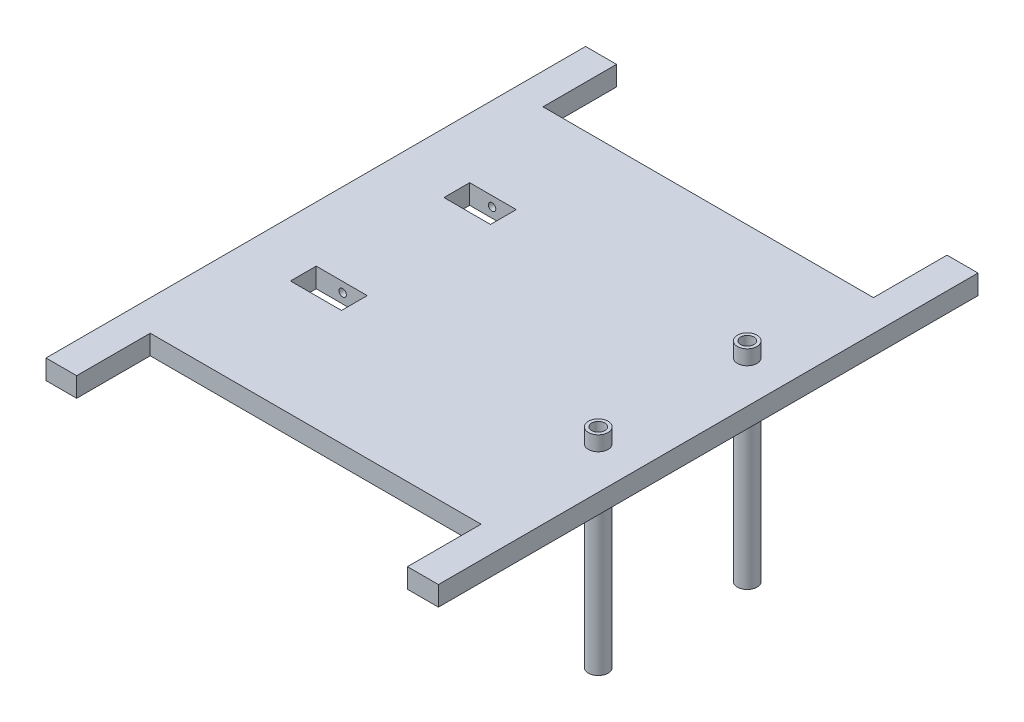
ISO-10303-21;
HEADER;
FILE_DESCRIPTION(('STEP AP214'),'2;1');
FILE_NAME('part.step','',(''),(''),'','','');
FILE_SCHEMA(('AUTOMOTIVE_DESIGN { 1 0 10303 214 1 1 1 1 }'));
ENDSEC;
DATA;
#1=APPLICATION_CONTEXT('core data for automotive mechanical design processes');
#2=APPLICATION_PROTOCOL_DEFINITION('international standard','automotive_design',2000,#1);
#3=PRODUCT_CONTEXT('',#1,'mechanical');
#4=PRODUCT('Part','Part','',(#3));
#5=PRODUCT_RELATED_PRODUCT_CATEGORY('part','',(#4));
#6=PRODUCT_DEFINITION_FORMATION('','',#4);
#7=PRODUCT_DEFINITION_CONTEXT('part definition',#1,'design');
#8=PRODUCT_DEFINITION('design','',#6,#7);
#9=PRODUCT_DEFINITION_SHAPE('','',#8);
#10=(LENGTH_UNIT() NAMED_UNIT(*) SI_UNIT(.MILLI.,.METRE.));
#11=(NAMED_UNIT(*) PLANE_ANGLE_UNIT() SI_UNIT($,.RADIAN.));
#12=(NAMED_UNIT(*) SI_UNIT($,.STERADIAN.) SOLID_ANGLE_UNIT());
#13=UNCERTAINTY_MEASURE_WITH_UNIT(LENGTH_MEASURE(1.E-05),#10,'distance_accuracy_value','');
#14=(GEOMETRIC_REPRESENTATION_CONTEXT(3) GLOBAL_UNCERTAINTY_ASSIGNED_CONTEXT((#13)) GLOBAL_UNIT_ASSIGNED_CONTEXT((#10,
#11,#12)) REPRESENTATION_CONTEXT('',''));
#15=CARTESIAN_POINT('',(0.,0.,0.));
#16=DIRECTION('',(0.,0.,1.));
#17=DIRECTION('',(1.,0.,0.));
#18=AXIS2_PLACEMENT_3D('',#15,#16,#17);
#19=CARTESIAN_POINT('',(160.,-4.,-80.));
#20=DIRECTION('',(0.,0.,1.));
#21=DIRECTION('',(1.,0.,0.));
#22=AXIS2_PLACEMENT_3D('',#19,#20,#21);
#23=PLANE('',#22);
#24=DIRECTION('',(0.,-1.,0.));
#25=VECTOR('',#24,1.);
#26=CARTESIAN_POINT('',(12.63,4.,-80.));
#27=LINE('',#26,#25);
#28=CARTESIAN_POINT('',(12.63,4.,-80.));
#29=VERTEX_POINT('',#28);
#30=CARTESIAN_POINT('',(12.63,-4.,-80.));
#31=VERTEX_POINT('',#30);
#32=EDGE_CURVE('E218',#29,#31,#27,.T.);
#33=ORIENTED_EDGE('',*,*,#32,.F.);
#34=DIRECTION('',(-1.,0.,0.));
#35=VECTOR('',#34,1.);
#36=CARTESIAN_POINT('',(160.,4.,-80.));
#37=LINE('',#36,#35);
#38=CARTESIAN_POINT('',(147.37,4.,-80.));
#39=VERTEX_POINT('',#38);
#40=EDGE_CURVE('E372',#39,#29,#37,.T.);
#41=ORIENTED_EDGE('',*,*,#40,.F.);
#42=DIRECTION('',(0.,1.,0.));
#43=VECTOR('',#42,1.);
#44=CARTESIAN_POINT('',(147.37,4.,-80.));
#45=LINE('',#44,#43);
#46=CARTESIAN_POINT('',(147.37,-4.,-80.));
#47=VERTEX_POINT('',#46);
#48=EDGE_CURVE('E275',#47,#39,#45,.T.);
#49=ORIENTED_EDGE('',*,*,#48,.F.);
#50=DIRECTION('',(-1.,0.,0.));
#51=VECTOR('',#50,1.);
#52=CARTESIAN_POINT('',(160.,-4.,-80.));
#53=LINE('',#52,#51);
#54=EDGE_CURVE('E359',#47,#31,#53,.T.);
#55=ORIENTED_EDGE('',*,*,#54,.T.);
#56=EDGE_LOOP('',(#33,#41,#49,#55));
#57=FACE_BOUND('',#56,.T.);
#58=ADVANCED_FACE('F43',(#57),#23,.F.);
#59=CARTESIAN_POINT('',(160.,-4.,80.));
#60=DIRECTION('',(0.,0.,-1.));
#61=DIRECTION('',(-1.,0.,0.));
#62=AXIS2_PLACEMENT_3D('',#59,#60,#61);
#63=PLANE('',#62);
#64=DIRECTION('',(0.,-1.,0.));
#65=VECTOR('',#64,1.);
#66=CARTESIAN_POINT('',(147.37,-4.,80.));
#67=LINE('',#66,#65);
#68=CARTESIAN_POINT('',(147.37,4.,80.));
#69=VERTEX_POINT('',#68);
#70=CARTESIAN_POINT('',(147.37,-4.,80.));
#71=VERTEX_POINT('',#70);
#72=EDGE_CURVE('E301',#69,#71,#67,.T.);
#73=ORIENTED_EDGE('',*,*,#72,.F.);
#74=DIRECTION('',(-1.,0.,0.));
#75=VECTOR('',#74,1.);
#76=CARTESIAN_POINT('',(160.,4.,80.));
#77=LINE('',#76,#75);
#78=CARTESIAN_POINT('',(12.5,4.,80.));
#79=VERTEX_POINT('',#78);
#80=EDGE_CURVE('E369',#69,#79,#77,.T.);
#81=ORIENTED_EDGE('',*,*,#80,.T.);
#82=DIRECTION('',(0.,1.,0.));
#83=VECTOR('',#82,1.);
#84=CARTESIAN_POINT('',(12.5,4.,80.));
#85=LINE('',#84,#83);
#86=CARTESIAN_POINT('',(12.5,-4.,80.));
#87=VERTEX_POINT('',#86);
#88=EDGE_CURVE('E325',#87,#79,#85,.T.);
#89=ORIENTED_EDGE('',*,*,#88,.F.);
#90=DIRECTION('',(-1.,0.,0.));
#91=VECTOR('',#90,1.);
#92=CARTESIAN_POINT('',(160.,-4.,80.));
#93=LINE('',#92,#91);
#94=EDGE_CURVE('E366',#71,#87,#93,.T.);
#95=ORIENTED_EDGE('',*,*,#94,.F.);
#96=EDGE_LOOP('',(#73,#81,#89,#95));
#97=FACE_BOUND('',#96,.T.);
#98=ADVANCED_FACE('F475',(#97),#63,.F.);
#99=CARTESIAN_POINT('',(160.,4.,80.));
#100=DIRECTION('',(0.,-1.,0.));
#101=DIRECTION('',(0.,0.,-1.));
#102=AXIS2_PLACEMENT_3D('',#99,#100,#101);
#103=PLANE('',#102);
#104=CARTESIAN_POINT('',(142.895014092763,4.,-33.0158476848538));
#105=DIRECTION('',(0.,-1.,0.));
#106=DIRECTION('',(0.,0.,-1.));
#107=AXIS2_PLACEMENT_3D('',#104,#105,#106);
#108=CIRCLE('',#107,3.99999999999999);
#109=CARTESIAN_POINT('',(142.895014092763,4.,-37.0158476848538));
#110=VERTEX_POINT('',#109);
#111=EDGE_CURVE('E429',#110,#110,#108,.T.);
#112=ORIENTED_EDGE('',*,*,#111,.T.);
#113=EDGE_LOOP('',(#112));
#114=FACE_BOUND('',#113,.T.);
#115=CARTESIAN_POINT('',(142.895014092763,4.,27.7315317803512));
#116=DIRECTION('',(0.,-1.,0.));
#117=DIRECTION('',(0.,0.,-1.));
#118=AXIS2_PLACEMENT_3D('',#115,#116,#117);
#119=CIRCLE('',#118,3.99999999999999);
#120=CARTESIAN_POINT('',(142.895014092763,4.,23.7315317803512));
#121=VERTEX_POINT('',#120);
#122=EDGE_CURVE('E413',#121,#121,#119,.T.);
#123=ORIENTED_EDGE('',*,*,#122,.T.);
#124=EDGE_LOOP('',(#123));
#125=FACE_BOUND('',#124,.T.);
#126=DIRECTION('',(-1.,0.,0.));
#127=VECTOR('',#126,1.);
#128=CARTESIAN_POINT('',(24.4683046302924,4.,-38.2658476848538));
#129=LINE('',#128,#127);
#130=CARTESIAN_POINT('',(43.4683046302924,4.,-38.2658476848538));
#131=VERTEX_POINT('',#130);
#132=CARTESIAN_POINT('',(24.4683046302924,4.,-38.2658476848538));
#133=VERTEX_POINT('',#132);
#134=EDGE_CURVE('E200',#131,#133,#129,.T.);
#135=ORIENTED_EDGE('',*,*,#134,.F.);
#136=DIRECTION('',(0.,0.,-1.));
#137=VECTOR('',#136,1.);
#138=CARTESIAN_POINT('',(43.4683046302924,4.,-38.2658476848538));
#139=LINE('',#138,#137);
#140=CARTESIAN_POINT('',(43.4683046302924,4.,-27.7658476848538));
#141=VERTEX_POINT('',#140);
#142=EDGE_CURVE('E60',#141,#131,#139,.T.);
#143=ORIENTED_EDGE('',*,*,#142,.F.);
#144=DIRECTION('',(1.,0.,0.));
#145=VECTOR('',#144,1.);
#146=CARTESIAN_POINT('',(24.4683046302924,4.,-27.7658476848538));
#147=LINE('',#146,#145);
#148=CARTESIAN_POINT('',(24.4683046302924,4.,-27.7658476848538));
#149=VERTEX_POINT('',#148);
#150=EDGE_CURVE('E208',#149,#141,#147,.T.);
#151=ORIENTED_EDGE('',*,*,#150,.F.);
#152=DIRECTION('',(0.,0.,1.));
#153=VECTOR('',#152,1.);
#154=CARTESIAN_POINT('',(24.4683046302924,4.,-38.2658476848538));
#155=LINE('',#154,#153);
#156=EDGE_CURVE('E189',#133,#149,#155,.T.);
#157=ORIENTED_EDGE('',*,*,#156,.F.);
#158=EDGE_LOOP('',(#135,#143,#151,#157));
#159=FACE_BOUND('',#158,.T.);
#160=DIRECTION('',(-1.,0.,0.));
#161=VECTOR('',#160,1.);
#162=CARTESIAN_POINT('',(22.6493816507544,4.,22.4815317803512));
#163=LINE('',#162,#161);
#164=CARTESIAN_POINT('',(43.4683046302924,4.,22.4815317803512));
#165=VERTEX_POINT('',#164);
#166=CARTESIAN_POINT('',(22.6493816507544,4.,22.4815317803512));
#167=VERTEX_POINT('',#166);
#168=EDGE_CURVE('E244',#165,#167,#163,.T.);
#169=ORIENTED_EDGE('',*,*,#168,.F.);
#170=DIRECTION('',(0.,0.,-1.));
#171=VECTOR('',#170,1.);
#172=CARTESIAN_POINT('',(43.4683046302924,4.,32.9815317803512));
#173=LINE('',#172,#171);
#174=CARTESIAN_POINT('',(43.4683046302924,4.,32.9815317803512));
#175=VERTEX_POINT('',#174);
#176=EDGE_CURVE('E68',#175,#165,#173,.T.);
#177=ORIENTED_EDGE('',*,*,#176,.F.);
#178=DIRECTION('',(1.,0.,0.));
#179=VECTOR('',#178,1.);
#180=CARTESIAN_POINT('',(22.6493816507544,4.,32.9815317803512));
#181=LINE('',#180,#179);
#182=CARTESIAN_POINT('',(22.6493816507544,4.,32.9815317803512));
#183=VERTEX_POINT('',#182);
#184=EDGE_CURVE('E226',#183,#175,#181,.T.);
#185=ORIENTED_EDGE('',*,*,#184,.F.);
#186=DIRECTION('',(0.,0.,1.));
#187=VECTOR('',#186,1.);
#188=CARTESIAN_POINT('',(22.6493816507544,4.,32.9815317803512));
#189=LINE('',#188,#187);
#190=EDGE_CURVE('E240',#167,#183,#189,.T.);
#191=ORIENTED_EDGE('',*,*,#190,.F.);
#192=EDGE_LOOP('',(#169,#177,#185,#191));
#193=FACE_BOUND('',#192,.T.);
#194=DIRECTION('',(0.,0.,1.));
#195=VECTOR('',#194,1.);
#196=CARTESIAN_POINT('',(0.,4.,80.));
#197=LINE('',#196,#195);
#198=CARTESIAN_POINT('',(0.,4.,-110.));
#199=VERTEX_POINT('',#198);
#200=CARTESIAN_POINT('',(0.,4.,110.));
#201=VERTEX_POINT('',#200);
#202=EDGE_CURVE('E351',#199,#201,#197,.T.);
#203=ORIENTED_EDGE('',*,*,#202,.T.);
#204=DIRECTION('',(-1.,0.,0.));
#205=VECTOR('',#204,1.);
#206=CARTESIAN_POINT('',(0.,4.,110.));
#207=LINE('',#206,#205);
#208=CARTESIAN_POINT('',(12.5,4.,110.));
#209=VERTEX_POINT('',#208);
#210=EDGE_CURVE('E336',#209,#201,#207,.T.);
#211=ORIENTED_EDGE('',*,*,#210,.F.);
#212=DIRECTION('',(0.,0.,-1.));
#213=VECTOR('',#212,1.);
#214=CARTESIAN_POINT('',(12.5,4.,110.));
#215=LINE('',#214,#213);
#216=EDGE_CURVE('E340',#209,#79,#215,.T.);
#217=ORIENTED_EDGE('',*,*,#216,.T.);
#218=ORIENTED_EDGE('',*,*,#80,.F.);
#219=DIRECTION('',(0.,0.,-1.));
#220=VECTOR('',#219,1.);
#221=CARTESIAN_POINT('',(147.37,4.,110.));
#222=LINE('',#221,#220);
#223=CARTESIAN_POINT('',(147.37,4.,110.));
#224=VERTEX_POINT('',#223);
#225=EDGE_CURVE('E322',#224,#69,#222,.T.);
#226=ORIENTED_EDGE('',*,*,#225,.F.);
#227=DIRECTION('',(-1.,0.,0.));
#228=VECTOR('',#227,1.);
#229=CARTESIAN_POINT('',(160.,4.,110.));
#230=LINE('',#229,#228);
#231=CARTESIAN_POINT('',(160.,4.,110.));
#232=VERTEX_POINT('',#231);
#233=EDGE_CURVE('E306',#232,#224,#230,.T.);
#234=ORIENTED_EDGE('',*,*,#233,.F.);
#235=DIRECTION('',(0.,0.,1.));
#236=VECTOR('',#235,1.);
#237=CARTESIAN_POINT('',(160.,4.,80.));
#238=LINE('',#237,#236);
#239=CARTESIAN_POINT('',(160.,4.,-110.));
#240=VERTEX_POINT('',#239);
#241=EDGE_CURVE('E352',#240,#232,#238,.T.);
#242=ORIENTED_EDGE('',*,*,#241,.F.);
#243=DIRECTION('',(1.,0.,0.));
#244=VECTOR('',#243,1.);
#245=CARTESIAN_POINT('',(160.,4.,-110.));
#246=LINE('',#245,#244);
#247=CARTESIAN_POINT('',(147.37,4.,-110.));
#248=VERTEX_POINT('',#247);
#249=EDGE_CURVE('E286',#248,#240,#246,.T.);
#250=ORIENTED_EDGE('',*,*,#249,.F.);
#251=DIRECTION('',(0.,0.,1.));
#252=VECTOR('',#251,1.);
#253=CARTESIAN_POINT('',(147.37,4.,-110.));
#254=LINE('',#253,#252);
#255=EDGE_CURVE('E290',#248,#39,#254,.T.);
#256=ORIENTED_EDGE('',*,*,#255,.T.);
#257=ORIENTED_EDGE('',*,*,#40,.T.);
#258=DIRECTION('',(0.,0.,1.));
#259=VECTOR('',#258,1.);
#260=CARTESIAN_POINT('',(12.63,4.,-110.));
#261=LINE('',#260,#259);
#262=CARTESIAN_POINT('',(12.63,4.,-110.));
#263=VERTEX_POINT('',#262);
#264=EDGE_CURVE('E271',#263,#29,#261,.T.);
#265=ORIENTED_EDGE('',*,*,#264,.F.);
#266=DIRECTION('',(1.,0.,0.));
#267=VECTOR('',#266,1.);
#268=CARTESIAN_POINT('',(0.,4.,-110.));
#269=LINE('',#268,#267);
#270=EDGE_CURVE('E254',#199,#263,#269,.T.);
#271=ORIENTED_EDGE('',*,*,#270,.F.);
#272=EDGE_LOOP('',(#203,#211,#217,#218,#226,#234,#242,#250,#256,#257,#265,#271));
#273=FACE_BOUND('',#272,.T.);
#274=ADVANCED_FACE('F205',(#114,#125,#159,#193,#273),#103,.F.);
#275=CARTESIAN_POINT('',(160.,-4.,80.));
#276=DIRECTION('',(0.,1.,0.));
#277=DIRECTION('',(0.,0.,1.));
#278=AXIS2_PLACEMENT_3D('',#275,#276,#277);
#279=PLANE('',#278);
#280=CARTESIAN_POINT('',(142.895014092763,-4.,-33.0158476848538));
#281=DIRECTION('',(0.,1.,0.));
#282=DIRECTION('',(0.,0.,1.));
#283=AXIS2_PLACEMENT_3D('',#280,#281,#282);
#284=CIRCLE('',#283,3.99999999999999);
#285=CARTESIAN_POINT('',(142.895014092763,-4.,-29.0158476848538));
#286=VERTEX_POINT('',#285);
#287=EDGE_CURVE('E46',#286,#286,#284,.T.);
#288=ORIENTED_EDGE('',*,*,#287,.T.);
#289=EDGE_LOOP('',(#288));
#290=FACE_BOUND('',#289,.T.);
#291=CARTESIAN_POINT('',(142.895014092763,-4.,27.7315317803512));
#292=DIRECTION('',(0.,1.,0.));
#293=DIRECTION('',(0.,0.,1.));
#294=AXIS2_PLACEMENT_3D('',#291,#292,#293);
#295=CIRCLE('',#294,3.99999999999999);
#296=CARTESIAN_POINT('',(142.895014092763,-4.,31.7315317803512));
#297=VERTEX_POINT('',#296);
#298=EDGE_CURVE('E410',#297,#297,#295,.T.);
#299=ORIENTED_EDGE('',*,*,#298,.T.);
#300=EDGE_LOOP('',(#299));
#301=FACE_BOUND('',#300,.T.);
#302=DIRECTION('',(1.,0.,0.));
#303=VECTOR('',#302,1.);
#304=CARTESIAN_POINT('',(160.,-4.,-27.7658476848538));
#305=LINE('',#304,#303);
#306=CARTESIAN_POINT('',(24.4683046302924,-4.,-27.7658476848538));
#307=VERTEX_POINT('',#306);
#308=CARTESIAN_POINT('',(43.4683046302924,-4.,-27.7658476848538));
#309=VERTEX_POINT('',#308);
#310=EDGE_CURVE('E52',#307,#309,#305,.T.);
#311=ORIENTED_EDGE('',*,*,#310,.T.);
#312=DIRECTION('',(0.,0.,-1.));
#313=VECTOR('',#312,1.);
#314=CARTESIAN_POINT('',(43.4683046302924,-4.,80.));
#315=LINE('',#314,#313);
#316=CARTESIAN_POINT('',(43.4683046302924,-4.,-38.2658476848538));
#317=VERTEX_POINT('',#316);
#318=EDGE_CURVE('E11',#309,#317,#315,.T.);
#319=ORIENTED_EDGE('',*,*,#318,.T.);
#320=DIRECTION('',(-1.,0.,0.));
#321=VECTOR('',#320,1.);
#322=CARTESIAN_POINT('',(160.,-4.,-38.2658476848538));
#323=LINE('',#322,#321);
#324=CARTESIAN_POINT('',(24.4683046302924,-4.,-38.2658476848538));
#325=VERTEX_POINT('',#324);
#326=EDGE_CURVE('E392',#317,#325,#323,.T.);
#327=ORIENTED_EDGE('',*,*,#326,.T.);
#328=DIRECTION('',(0.,0.,1.));
#329=VECTOR('',#328,1.);
#330=CARTESIAN_POINT('',(24.4683046302924,-4.,80.));
#331=LINE('',#330,#329);
#332=EDGE_CURVE('E192',#325,#307,#331,.T.);
#333=ORIENTED_EDGE('',*,*,#332,.T.);
#334=EDGE_LOOP('',(#311,#319,#327,#333));
#335=FACE_BOUND('',#334,.T.);
#336=DIRECTION('',(1.,0.,0.));
#337=VECTOR('',#336,1.);
#338=CARTESIAN_POINT('',(160.,-4.,32.9815317803512));
#339=LINE('',#338,#337);
#340=CARTESIAN_POINT('',(22.6493816507544,-4.,32.9815317803512));
#341=VERTEX_POINT('',#340);
#342=CARTESIAN_POINT('',(43.4683046302924,-4.,32.9815317803512));
#343=VERTEX_POINT('',#342);
#344=EDGE_CURVE('E384',#341,#343,#339,.T.);
#345=ORIENTED_EDGE('',*,*,#344,.T.);
#346=DIRECTION('',(0.,0.,-1.));
#347=VECTOR('',#346,1.);
#348=CARTESIAN_POINT('',(43.4683046302924,-4.,80.));
#349=LINE('',#348,#347);
#350=CARTESIAN_POINT('',(43.4683046302924,-4.,22.4815317803512));
#351=VERTEX_POINT('',#350);
#352=EDGE_CURVE('E388',#343,#351,#349,.T.);
#353=ORIENTED_EDGE('',*,*,#352,.T.);
#354=DIRECTION('',(-1.,0.,0.));
#355=VECTOR('',#354,1.);
#356=CARTESIAN_POINT('',(160.,-4.,22.4815317803512));
#357=LINE('',#356,#355);
#358=CARTESIAN_POINT('',(22.6493816507544,-4.,22.4815317803512));
#359=VERTEX_POINT('',#358);
#360=EDGE_CURVE('E376',#351,#359,#357,.T.);
#361=ORIENTED_EDGE('',*,*,#360,.T.);
#362=DIRECTION('',(0.,0.,1.));
#363=VECTOR('',#362,1.);
#364=CARTESIAN_POINT('',(22.6493816507544,-4.,80.));
#365=LINE('',#364,#363);
#366=EDGE_CURVE('E380',#359,#341,#365,.T.);
#367=ORIENTED_EDGE('',*,*,#366,.T.);
#368=EDGE_LOOP('',(#345,#353,#361,#367));
#369=FACE_BOUND('',#368,.T.);
#370=DIRECTION('',(0.,0.,-1.));
#371=VECTOR('',#370,1.);
#372=CARTESIAN_POINT('',(0.,-4.,80.));
#373=LINE('',#372,#371);
#374=CARTESIAN_POINT('',(0.,-4.,110.));
#375=VERTEX_POINT('',#374);
#376=CARTESIAN_POINT('',(0.,-4.,-110.));
#377=VERTEX_POINT('',#376);
#378=EDGE_CURVE('E356',#375,#377,#373,.T.);
#379=ORIENTED_EDGE('',*,*,#378,.T.);
#380=DIRECTION('',(-1.,0.,0.));
#381=VECTOR('',#380,1.);
#382=CARTESIAN_POINT('',(0.,-4.,-110.));
#383=LINE('',#382,#381);
#384=CARTESIAN_POINT('',(12.63,-4.,-110.));
#385=VERTEX_POINT('',#384);
#386=EDGE_CURVE('E260',#385,#377,#383,.T.);
#387=ORIENTED_EDGE('',*,*,#386,.F.);
#388=DIRECTION('',(0.,0.,1.));
#389=VECTOR('',#388,1.);
#390=CARTESIAN_POINT('',(12.63,-4.,-110.));
#391=LINE('',#390,#389);
#392=EDGE_CURVE('E264',#385,#31,#391,.T.);
#393=ORIENTED_EDGE('',*,*,#392,.T.);
#394=ORIENTED_EDGE('',*,*,#54,.F.);
#395=DIRECTION('',(0.,0.,1.));
#396=VECTOR('',#395,1.);
#397=CARTESIAN_POINT('',(147.37,-4.,-110.));
#398=LINE('',#397,#396);
#399=CARTESIAN_POINT('',(147.37,-4.,-110.));
#400=VERTEX_POINT('',#399);
#401=EDGE_CURVE('E297',#400,#47,#398,.T.);
#402=ORIENTED_EDGE('',*,*,#401,.F.);
#403=DIRECTION('',(-1.,0.,0.));
#404=VECTOR('',#403,1.);
#405=CARTESIAN_POINT('',(160.,-4.,-110.));
#406=LINE('',#405,#404);
#407=CARTESIAN_POINT('',(160.,-4.,-110.));
#408=VERTEX_POINT('',#407);
#409=EDGE_CURVE('E280',#408,#400,#406,.T.);
#410=ORIENTED_EDGE('',*,*,#409,.F.);
#411=DIRECTION('',(0.,0.,-1.));
#412=VECTOR('',#411,1.);
#413=CARTESIAN_POINT('',(160.,-4.,80.));
#414=LINE('',#413,#412);
#415=CARTESIAN_POINT('',(160.,-4.,110.));
#416=VERTEX_POINT('',#415);
#417=EDGE_CURVE('E355',#416,#408,#414,.T.);
#418=ORIENTED_EDGE('',*,*,#417,.F.);
#419=DIRECTION('',(1.,0.,0.));
#420=VECTOR('',#419,1.);
#421=CARTESIAN_POINT('',(160.,-4.,110.));
#422=LINE('',#421,#420);
#423=CARTESIAN_POINT('',(147.37,-4.,110.));
#424=VERTEX_POINT('',#423);
#425=EDGE_CURVE('E312',#424,#416,#422,.T.);
#426=ORIENTED_EDGE('',*,*,#425,.F.);
#427=DIRECTION('',(0.,0.,-1.));
#428=VECTOR('',#427,1.);
#429=CARTESIAN_POINT('',(147.37,-4.,110.));
#430=LINE('',#429,#428);
#431=EDGE_CURVE('E316',#424,#71,#430,.T.);
#432=ORIENTED_EDGE('',*,*,#431,.T.);
#433=ORIENTED_EDGE('',*,*,#94,.T.);
#434=DIRECTION('',(0.,0.,-1.));
#435=VECTOR('',#434,1.);
#436=CARTESIAN_POINT('',(12.5,-4.,110.));
#437=LINE('',#436,#435);
#438=CARTESIAN_POINT('',(12.5,-4.,110.));
#439=VERTEX_POINT('',#438);
#440=EDGE_CURVE('E347',#439,#87,#437,.T.);
#441=ORIENTED_EDGE('',*,*,#440,.F.);
#442=DIRECTION('',(1.,0.,0.));
#443=VECTOR('',#442,1.);
#444=CARTESIAN_POINT('',(0.,-4.,110.));
#445=LINE('',#444,#443);
#446=EDGE_CURVE('E330',#375,#439,#445,.T.);
#447=ORIENTED_EDGE('',*,*,#446,.F.);
#448=EDGE_LOOP('',(#379,#387,#393,#394,#402,#410,#418,#426,#432,#433,#441,#447));
#449=FACE_BOUND('',#448,.T.);
#450=ADVANCED_FACE('F509',(#290,#301,#335,#369,#449),#279,.F.);
#451=CARTESIAN_POINT('',(160.,0.,0.));
#452=DIRECTION('',(-1.,0.,0.));
#453=DIRECTION('',(0.,0.,1.));
#454=AXIS2_PLACEMENT_3D('',#451,#452,#453);
#455=PLANE('',#454);
#456=ORIENTED_EDGE('',*,*,#417,.T.);
#457=DIRECTION('',(0.,-1.,0.));
#458=VECTOR('',#457,1.);
#459=CARTESIAN_POINT('',(160.,4.,-110.));
#460=LINE('',#459,#458);
#461=EDGE_CURVE('E276',#240,#408,#460,.T.);
#462=ORIENTED_EDGE('',*,*,#461,.F.);
#463=ORIENTED_EDGE('',*,*,#241,.T.);
#464=DIRECTION('',(0.,1.,0.));
#465=VECTOR('',#464,1.);
#466=CARTESIAN_POINT('',(160.,-4.,110.));
#467=LINE('',#466,#465);
#468=EDGE_CURVE('E302',#416,#232,#467,.T.);
#469=ORIENTED_EDGE('',*,*,#468,.F.);
#470=EDGE_LOOP('',(#456,#462,#463,#469));
#471=FACE_BOUND('',#470,.T.);
#472=ADVANCED_FACE('F528',(#471),#455,.F.);
#473=CARTESIAN_POINT('',(0.,0.,0.));
#474=DIRECTION('',(-1.,0.,0.));
#475=DIRECTION('',(0.,0.,1.));
#476=AXIS2_PLACEMENT_3D('',#473,#474,#475);
#477=PLANE('',#476);
#478=ORIENTED_EDGE('',*,*,#202,.F.);
#479=DIRECTION('',(0.,1.,0.));
#480=VECTOR('',#479,1.);
#481=CARTESIAN_POINT('',(0.,4.,-110.));
#482=LINE('',#481,#480);
#483=EDGE_CURVE('E250',#377,#199,#482,.T.);
#484=ORIENTED_EDGE('',*,*,#483,.F.);
#485=ORIENTED_EDGE('',*,*,#378,.F.);
#486=DIRECTION('',(0.,-1.,0.));
#487=VECTOR('',#486,1.);
#488=CARTESIAN_POINT('',(0.,4.,110.));
#489=LINE('',#488,#487);
#490=EDGE_CURVE('E326',#201,#375,#489,.T.);
#491=ORIENTED_EDGE('',*,*,#490,.F.);
#492=EDGE_LOOP('',(#478,#484,#485,#491));
#493=FACE_BOUND('',#492,.T.);
#494=ADVANCED_FACE('F505',(#493),#477,.T.);
#495=CARTESIAN_POINT('',(12.5,4.,110.));
#496=DIRECTION('',(-1.,0.,0.));
#497=DIRECTION('',(0.,-1.,0.));
#498=AXIS2_PLACEMENT_3D('',#495,#496,#497);
#499=PLANE('',#498);
#500=ORIENTED_EDGE('',*,*,#88,.T.);
#501=ORIENTED_EDGE('',*,*,#216,.F.);
#502=DIRECTION('',(0.,1.,0.));
#503=VECTOR('',#502,1.);
#504=CARTESIAN_POINT('',(12.5,4.,110.));
#505=LINE('',#504,#503);
#506=EDGE_CURVE('E333',#439,#209,#505,.T.);
#507=ORIENTED_EDGE('',*,*,#506,.F.);
#508=ORIENTED_EDGE('',*,*,#440,.T.);
#509=EDGE_LOOP('',(#500,#501,#507,#508));
#510=FACE_BOUND('',#509,.T.);
#511=ADVANCED_FACE('F513',(#510),#499,.F.);
#512=CARTESIAN_POINT('',(0.,0.,110.));
#513=DIRECTION('',(0.,0.,1.));
#514=DIRECTION('',(1.,0.,0.));
#515=AXIS2_PLACEMENT_3D('',#512,#513,#514);
#516=PLANE('',#515);
#517=ORIENTED_EDGE('',*,*,#490,.T.);
#518=ORIENTED_EDGE('',*,*,#446,.T.);
#519=ORIENTED_EDGE('',*,*,#506,.T.);
#520=ORIENTED_EDGE('',*,*,#210,.T.);
#521=EDGE_LOOP('',(#517,#518,#519,#520));
#522=FACE_BOUND('',#521,.T.);
#523=ADVANCED_FACE('F502',(#522),#516,.T.);
#524=CARTESIAN_POINT('',(147.37,-4.,110.));
#525=DIRECTION('',(1.,0.,0.));
#526=DIRECTION('',(0.,0.,-1.));
#527=AXIS2_PLACEMENT_3D('',#524,#525,#526);
#528=PLANE('',#527);
#529=ORIENTED_EDGE('',*,*,#72,.T.);
#530=ORIENTED_EDGE('',*,*,#431,.F.);
#531=DIRECTION('',(0.,-1.,0.));
#532=VECTOR('',#531,1.);
#533=CARTESIAN_POINT('',(147.37,-4.,110.));
#534=LINE('',#533,#532);
#535=EDGE_CURVE('E309',#224,#424,#534,.T.);
#536=ORIENTED_EDGE('',*,*,#535,.F.);
#537=ORIENTED_EDGE('',*,*,#225,.T.);
#538=EDGE_LOOP('',(#529,#530,#536,#537));
#539=FACE_BOUND('',#538,.T.);
#540=ADVANCED_FACE('F521',(#539),#528,.F.);
#541=CARTESIAN_POINT('',(0.,0.,110.));
#542=DIRECTION('',(0.,0.,1.));
#543=DIRECTION('',(1.,0.,0.));
#544=AXIS2_PLACEMENT_3D('',#541,#542,#543);
#545=PLANE('',#544);
#546=ORIENTED_EDGE('',*,*,#468,.T.);
#547=ORIENTED_EDGE('',*,*,#233,.T.);
#548=ORIENTED_EDGE('',*,*,#535,.T.);
#549=ORIENTED_EDGE('',*,*,#425,.T.);
#550=EDGE_LOOP('',(#546,#547,#548,#549));
#551=FACE_BOUND('',#550,.T.);
#552=ADVANCED_FACE('F526',(#551),#545,.T.);
#553=CARTESIAN_POINT('',(147.37,4.,-110.));
#554=DIRECTION('',(1.,0.,0.));
#555=DIRECTION('',(0.,0.,-1.));
#556=AXIS2_PLACEMENT_3D('',#553,#554,#555);
#557=PLANE('',#556);
#558=ORIENTED_EDGE('',*,*,#48,.T.);
#559=ORIENTED_EDGE('',*,*,#255,.F.);
#560=DIRECTION('',(0.,1.,0.));
#561=VECTOR('',#560,1.);
#562=CARTESIAN_POINT('',(147.37,4.,-110.));
#563=LINE('',#562,#561);
#564=EDGE_CURVE('E283',#400,#248,#563,.T.);
#565=ORIENTED_EDGE('',*,*,#564,.F.);
#566=ORIENTED_EDGE('',*,*,#401,.T.);
#567=EDGE_LOOP('',(#558,#559,#565,#566));
#568=FACE_BOUND('',#567,.T.);
#569=ADVANCED_FACE('F535',(#568),#557,.F.);
#570=CARTESIAN_POINT('',(0.,0.,-110.));
#571=DIRECTION('',(0.,0.,-1.));
#572=DIRECTION('',(-1.,0.,0.));
#573=AXIS2_PLACEMENT_3D('',#570,#571,#572);
#574=PLANE('',#573);
#575=ORIENTED_EDGE('',*,*,#461,.T.);
#576=ORIENTED_EDGE('',*,*,#409,.T.);
#577=ORIENTED_EDGE('',*,*,#564,.T.);
#578=ORIENTED_EDGE('',*,*,#249,.T.);
#579=EDGE_LOOP('',(#575,#576,#577,#578));
#580=FACE_BOUND('',#579,.T.);
#581=ADVANCED_FACE('F531',(#580),#574,.T.);
#582=CARTESIAN_POINT('',(12.63,4.,-110.));
#583=DIRECTION('',(-1.,0.,0.));
#584=DIRECTION('',(0.,-1.,0.));
#585=AXIS2_PLACEMENT_3D('',#582,#583,#584);
#586=PLANE('',#585);
#587=ORIENTED_EDGE('',*,*,#32,.T.);
#588=ORIENTED_EDGE('',*,*,#392,.F.);
#589=DIRECTION('',(0.,-1.,0.));
#590=VECTOR('',#589,1.);
#591=CARTESIAN_POINT('',(12.63,4.,-110.));
#592=LINE('',#591,#590);
#593=EDGE_CURVE('E257',#263,#385,#592,.T.);
#594=ORIENTED_EDGE('',*,*,#593,.F.);
#595=ORIENTED_EDGE('',*,*,#264,.T.);
#596=EDGE_LOOP('',(#587,#588,#594,#595));
#597=FACE_BOUND('',#596,.T.);
#598=ADVANCED_FACE('F493',(#597),#586,.F.);
#599=CARTESIAN_POINT('',(0.,0.,-110.));
#600=DIRECTION('',(0.,0.,1.));
#601=DIRECTION('',(1.,0.,0.));
#602=AXIS2_PLACEMENT_3D('',#599,#600,#601);
#603=PLANE('',#602);
#604=ORIENTED_EDGE('',*,*,#483,.T.);
#605=ORIENTED_EDGE('',*,*,#270,.T.);
#606=ORIENTED_EDGE('',*,*,#593,.T.);
#607=ORIENTED_EDGE('',*,*,#386,.T.);
#608=EDGE_LOOP('',(#604,#605,#606,#607));
#609=FACE_BOUND('',#608,.T.);
#610=ADVANCED_FACE('F496',(#609),#603,.F.);
#611=CARTESIAN_POINT('',(43.4683046302924,-6.,32.9815317803512));
#612=DIRECTION('',(1.,0.,0.));
#613=DIRECTION('',(0.,0.,-1.));
#614=AXIS2_PLACEMENT_3D('',#611,#612,#613);
#615=PLANE('',#614);
#616=DIRECTION('',(0.,1.,0.));
#617=VECTOR('',#616,1.);
#618=CARTESIAN_POINT('',(43.4683046302924,-6.,32.9815317803512));
#619=LINE('',#618,#617);
#620=EDGE_CURVE('E233',#343,#175,#619,.T.);
#621=ORIENTED_EDGE('',*,*,#620,.T.);
#622=ORIENTED_EDGE('',*,*,#176,.T.);
#623=DIRECTION('',(0.,1.,0.));
#624=VECTOR('',#623,1.);
#625=CARTESIAN_POINT('',(43.4683046302924,-6.,22.4815317803512));
#626=LINE('',#625,#624);
#627=EDGE_CURVE('E223',#351,#165,#626,.T.);
#628=ORIENTED_EDGE('',*,*,#627,.F.);
#629=ORIENTED_EDGE('',*,*,#352,.F.);
#630=EDGE_LOOP('',(#621,#622,#628,#629));
#631=FACE_BOUND('',#630,.T.);
#632=ADVANCED_FACE('F616',(#631),#615,.F.);
#633=CARTESIAN_POINT('',(22.6493816507544,-6.,32.9815317803512));
#634=DIRECTION('',(0.,0.,1.));
#635=DIRECTION('',(1.,0.,0.));
#636=AXIS2_PLACEMENT_3D('',#633,#634,#635);
#637=PLANE('',#636);
#638=CARTESIAN_POINT('',(33.4467865856431,0.,32.9815317803512));
#639=DIRECTION('',(0.,0.,1.));
#640=DIRECTION('',(1.,0.,0.));
#641=AXIS2_PLACEMENT_3D('',#638,#639,#640);
#642=CIRCLE('',#641,1.5);
#643=CARTESIAN_POINT('',(34.9467865856431,0.,32.9815317803512));
#644=VERTEX_POINT('',#643);
#645=EDGE_CURVE('E408',#644,#644,#642,.T.);
#646=ORIENTED_EDGE('',*,*,#645,.T.);
#647=EDGE_LOOP('',(#646));
#648=FACE_BOUND('',#647,.T.);
#649=DIRECTION('',(0.,1.,0.));
#650=VECTOR('',#649,1.);
#651=CARTESIAN_POINT('',(22.6493816507544,-6.,32.9815317803512));
#652=LINE('',#651,#650);
#653=EDGE_CURVE('E230',#341,#183,#652,.T.);
#654=ORIENTED_EDGE('',*,*,#653,.T.);
#655=ORIENTED_EDGE('',*,*,#184,.T.);
#656=ORIENTED_EDGE('',*,*,#620,.F.);
#657=ORIENTED_EDGE('',*,*,#344,.F.);
#658=EDGE_LOOP('',(#654,#655,#656,#657));
#659=FACE_BOUND('',#658,.T.);
#660=ADVANCED_FACE('F619',(#648,#659),#637,.F.);
#661=CARTESIAN_POINT('',(22.6493816507544,-6.,32.9815317803512));
#662=DIRECTION('',(-1.,0.,0.));
#663=DIRECTION('',(0.,0.,1.));
#664=AXIS2_PLACEMENT_3D('',#661,#662,#663);
#665=PLANE('',#664);
#666=DIRECTION('',(0.,1.,0.));
#667=VECTOR('',#666,1.);
#668=CARTESIAN_POINT('',(22.6493816507544,-6.,22.4815317803512));
#669=LINE('',#668,#667);
#670=EDGE_CURVE('E227',#359,#167,#669,.T.);
#671=ORIENTED_EDGE('',*,*,#670,.T.);
#672=ORIENTED_EDGE('',*,*,#190,.T.);
#673=ORIENTED_EDGE('',*,*,#653,.F.);
#674=ORIENTED_EDGE('',*,*,#366,.F.);
#675=EDGE_LOOP('',(#671,#672,#673,#674));
#676=FACE_BOUND('',#675,.T.);
#677=ADVANCED_FACE('F622',(#676),#665,.F.);
#678=CARTESIAN_POINT('',(22.6493816507544,-6.,22.4815317803512));
#679=DIRECTION('',(0.,0.,-1.));
#680=DIRECTION('',(-1.,0.,0.));
#681=AXIS2_PLACEMENT_3D('',#678,#679,#680);
#682=PLANE('',#681);
#683=CARTESIAN_POINT('',(33.4467865856431,0.,22.4815317803512));
#684=DIRECTION('',(0.,0.,-1.));
#685=DIRECTION('',(-1.,0.,0.));
#686=AXIS2_PLACEMENT_3D('',#683,#684,#685);
#687=CIRCLE('',#686,1.5);
#688=CARTESIAN_POINT('',(31.9467865856431,0.,22.4815317803512));
#689=VERTEX_POINT('',#688);
#690=EDGE_CURVE('E405',#689,#689,#687,.T.);
#691=ORIENTED_EDGE('',*,*,#690,.T.);
#692=EDGE_LOOP('',(#691));
#693=FACE_BOUND('',#692,.T.);
#694=ORIENTED_EDGE('',*,*,#627,.T.);
#695=ORIENTED_EDGE('',*,*,#168,.T.);
#696=ORIENTED_EDGE('',*,*,#670,.F.);
#697=ORIENTED_EDGE('',*,*,#360,.F.);
#698=EDGE_LOOP('',(#694,#695,#696,#697));
#699=FACE_BOUND('',#698,.T.);
#700=ADVANCED_FACE('F615',(#693,#699),#682,.F.);
#701=CARTESIAN_POINT('',(43.4683046302924,-6.,-38.2658476848538));
#702=DIRECTION('',(1.,0.,0.));
#703=DIRECTION('',(0.,0.,-1.));
#704=AXIS2_PLACEMENT_3D('',#701,#702,#703);
#705=PLANE('',#704);
#706=DIRECTION('',(0.,1.,0.));
#707=VECTOR('',#706,1.);
#708=CARTESIAN_POINT('',(43.4683046302924,-6.,-27.7658476848538));
#709=LINE('',#708,#707);
#710=EDGE_CURVE('E215',#309,#141,#709,.T.);
#711=ORIENTED_EDGE('',*,*,#710,.T.);
#712=ORIENTED_EDGE('',*,*,#142,.T.);
#713=DIRECTION('',(0.,1.,0.));
#714=VECTOR('',#713,1.);
#715=CARTESIAN_POINT('',(43.4683046302924,-6.,-38.2658476848538));
#716=LINE('',#715,#714);
#717=EDGE_CURVE('E197',#317,#131,#716,.T.);
#718=ORIENTED_EDGE('',*,*,#717,.F.);
#719=ORIENTED_EDGE('',*,*,#318,.F.);
#720=EDGE_LOOP('',(#711,#712,#718,#719));
#721=FACE_BOUND('',#720,.T.);
#722=ADVANCED_FACE('F612',(#721),#705,.F.);
#723=CARTESIAN_POINT('',(24.4683046302924,-6.,-27.7658476848538));
#724=DIRECTION('',(0.,0.,1.));
#725=DIRECTION('',(1.,0.,0.));
#726=AXIS2_PLACEMENT_3D('',#723,#724,#725);
#727=PLANE('',#726);
#728=CARTESIAN_POINT('',(33.6192058945851,0.,-27.7658476848538));
#729=DIRECTION('',(0.,0.,1.));
#730=DIRECTION('',(1.,0.,0.));
#731=AXIS2_PLACEMENT_3D('',#728,#729,#730);
#732=CIRCLE('',#731,1.5);
#733=CARTESIAN_POINT('',(35.1192058945851,0.,-27.7658476848538));
#734=VERTEX_POINT('',#733);
#735=EDGE_CURVE('E236',#734,#734,#732,.T.);
#736=ORIENTED_EDGE('',*,*,#735,.T.);
#737=EDGE_LOOP('',(#736));
#738=FACE_BOUND('',#737,.T.);
#739=DIRECTION('',(0.,1.,0.));
#740=VECTOR('',#739,1.);
#741=CARTESIAN_POINT('',(24.4683046302924,-6.,-27.7658476848538));
#742=LINE('',#741,#740);
#743=EDGE_CURVE('E196',#307,#149,#742,.T.);
#744=ORIENTED_EDGE('',*,*,#743,.T.);
#745=ORIENTED_EDGE('',*,*,#150,.T.);
#746=ORIENTED_EDGE('',*,*,#710,.F.);
#747=ORIENTED_EDGE('',*,*,#310,.F.);
#748=EDGE_LOOP('',(#744,#745,#746,#747));
#749=FACE_BOUND('',#748,.T.);
#750=ADVANCED_FACE('F455',(#738,#749),#727,.F.);
#751=CARTESIAN_POINT('',(24.4683046302924,-6.,-38.2658476848538));
#752=DIRECTION('',(-1.,0.,0.));
#753=DIRECTION('',(0.,0.,1.));
#754=AXIS2_PLACEMENT_3D('',#751,#752,#753);
#755=PLANE('',#754);
#756=DIRECTION('',(0.,1.,0.));
#757=VECTOR('',#756,1.);
#758=CARTESIAN_POINT('',(24.4683046302924,-6.,-38.2658476848538));
#759=LINE('',#758,#757);
#760=EDGE_CURVE('E184',#325,#133,#759,.T.);
#761=ORIENTED_EDGE('',*,*,#760,.T.);
#762=ORIENTED_EDGE('',*,*,#156,.T.);
#763=ORIENTED_EDGE('',*,*,#743,.F.);
#764=ORIENTED_EDGE('',*,*,#332,.F.);
#765=EDGE_LOOP('',(#761,#762,#763,#764));
#766=FACE_BOUND('',#765,.T.);
#767=ADVANCED_FACE('F186',(#766),#755,.F.);
#768=CARTESIAN_POINT('',(24.4683046302924,-6.,-38.2658476848538));
#769=DIRECTION('',(0.,0.,-1.));
#770=DIRECTION('',(-1.,0.,0.));
#771=AXIS2_PLACEMENT_3D('',#768,#769,#770);
#772=PLANE('',#771);
#773=CARTESIAN_POINT('',(33.6192058945851,0.,-38.2658476848538));
#774=DIRECTION('',(0.,0.,-1.));
#775=DIRECTION('',(-1.,0.,0.));
#776=AXIS2_PLACEMENT_3D('',#773,#774,#775);
#777=CIRCLE('',#776,1.5);
#778=CARTESIAN_POINT('',(32.1192058945851,0.,-38.2658476848538));
#779=VERTEX_POINT('',#778);
#780=EDGE_CURVE('E400',#779,#779,#777,.T.);
#781=ORIENTED_EDGE('',*,*,#780,.T.);
#782=EDGE_LOOP('',(#781));
#783=FACE_BOUND('',#782,.T.);
#784=ORIENTED_EDGE('',*,*,#717,.T.);
#785=ORIENTED_EDGE('',*,*,#134,.T.);
#786=ORIENTED_EDGE('',*,*,#760,.F.);
#787=ORIENTED_EDGE('',*,*,#326,.F.);
#788=EDGE_LOOP('',(#784,#785,#786,#787));
#789=FACE_BOUND('',#788,.T.);
#790=ADVANCED_FACE('F201',(#783,#789),#772,.F.);
#791=CARTESIAN_POINT('',(33.6192058945851,0.,-63.2658476848538));
#792=DIRECTION('',(0.,0.,1.));
#793=DIRECTION('',(1.,0.,0.));
#794=AXIS2_PLACEMENT_3D('',#791,#792,#793);
#795=PLANE('',#794);
#796=CARTESIAN_POINT('',(33.6192058945851,0.,-63.2658476848538));
#797=DIRECTION('',(0.,0.,1.));
#798=DIRECTION('',(1.,0.,0.));
#799=AXIS2_PLACEMENT_3D('',#796,#797,#798);
#800=CIRCLE('',#799,1.5);
#801=CARTESIAN_POINT('',(35.1192058945851,0.,-63.2658476848538));
#802=VERTEX_POINT('',#801);
#803=EDGE_CURVE('E404',#802,#802,#800,.T.);
#804=ORIENTED_EDGE('',*,*,#803,.T.);
#805=EDGE_LOOP('',(#804));
#806=FACE_BOUND('',#805,.T.);
#807=ADVANCED_FACE('F471',(#806),#795,.T.);
#808=CARTESIAN_POINT('',(33.6192058945851,0.,-63.2658476848538));
#809=DIRECTION('',(0.,0.,1.));
#810=DIRECTION('',(1.,0.,0.));
#811=AXIS2_PLACEMENT_3D('',#808,#809,#810);
#812=CYLINDRICAL_SURFACE('',#811,1.5);
#813=ORIENTED_EDGE('',*,*,#803,.F.);
#814=EDGE_LOOP('',(#813));
#815=FACE_BOUND('',#814,.T.);
#816=ORIENTED_EDGE('',*,*,#780,.F.);
#817=EDGE_LOOP('',(#816));
#818=FACE_BOUND('',#817,.T.);
#819=ADVANCED_FACE('F461',(#815,#818),#812,.F.);
#820=CARTESIAN_POINT('',(33.6192058945851,0.,-13.2658476848538));
#821=DIRECTION('',(0.,0.,1.));
#822=DIRECTION('',(1.,0.,0.));
#823=AXIS2_PLACEMENT_3D('',#820,#821,#822);
#824=CIRCLE('',#823,1.5);
#825=CARTESIAN_POINT('',(35.1192058945851,0.,-13.2658476848538));
#826=VERTEX_POINT('',#825);
#827=EDGE_CURVE('E443',#826,#826,#824,.T.);
#828=ORIENTED_EDGE('',*,*,#827,.T.);
#829=EDGE_LOOP('',(#828));
#830=FACE_BOUND('',#829,.T.);
#831=ORIENTED_EDGE('',*,*,#735,.F.);
#832=EDGE_LOOP('',(#831));
#833=FACE_BOUND('',#832,.T.);
#834=ADVANCED_FACE('F458',(#830,#833),#812,.F.);
#835=CARTESIAN_POINT('',(33.6192058945851,0.,-13.2658476848538));
#836=DIRECTION('',(0.,0.,1.));
#837=DIRECTION('',(1.,0.,0.));
#838=AXIS2_PLACEMENT_3D('',#835,#836,#837);
#839=PLANE('',#838);
#840=ORIENTED_EDGE('',*,*,#827,.F.);
#841=EDGE_LOOP('',(#840));
#842=FACE_BOUND('',#841,.T.);
#843=ADVANCED_FACE('F460',(#842),#839,.F.);
#844=CARTESIAN_POINT('',(33.4467865856431,0.,-2.5184682196488));
#845=DIRECTION('',(0.,0.,1.));
#846=DIRECTION('',(1.,0.,0.));
#847=AXIS2_PLACEMENT_3D('',#844,#845,#846);
#848=PLANE('',#847);
#849=CARTESIAN_POINT('',(33.4467865856431,0.,-2.5184682196488));
#850=DIRECTION('',(0.,0.,1.));
#851=DIRECTION('',(1.,0.,0.));
#852=AXIS2_PLACEMENT_3D('',#849,#850,#851);
#853=CIRCLE('',#852,1.5);
#854=CARTESIAN_POINT('',(34.9467865856431,0.,-2.5184682196488));
#855=VERTEX_POINT('',#854);
#856=EDGE_CURVE('E409',#855,#855,#853,.T.);
#857=ORIENTED_EDGE('',*,*,#856,.T.);
#858=EDGE_LOOP('',(#857));
#859=FACE_BOUND('',#858,.T.);
#860=ADVANCED_FACE('F468',(#859),#848,.T.);
#861=CARTESIAN_POINT('',(33.4467865856431,0.,-2.5184682196488));
#862=DIRECTION('',(0.,0.,1.));
#863=DIRECTION('',(1.,0.,0.));
#864=AXIS2_PLACEMENT_3D('',#861,#862,#863);
#865=CYLINDRICAL_SURFACE('',#864,1.5);
#866=ORIENTED_EDGE('',*,*,#856,.F.);
#867=EDGE_LOOP('',(#866));
#868=FACE_BOUND('',#867,.T.);
#869=ORIENTED_EDGE('',*,*,#690,.F.);
#870=EDGE_LOOP('',(#869));
#871=FACE_BOUND('',#870,.T.);
#872=ADVANCED_FACE('F587',(#868,#871),#865,.F.);
#873=CARTESIAN_POINT('',(33.4467865856431,0.,47.4815317803512));
#874=DIRECTION('',(0.,0.,1.));
#875=DIRECTION('',(1.,0.,0.));
#876=AXIS2_PLACEMENT_3D('',#873,#874,#875);
#877=CIRCLE('',#876,1.5);
#878=CARTESIAN_POINT('',(34.9467865856431,0.,47.4815317803512));
#879=VERTEX_POINT('',#878);
#880=EDGE_CURVE('E420',#879,#879,#877,.T.);
#881=ORIENTED_EDGE('',*,*,#880,.T.);
#882=EDGE_LOOP('',(#881));
#883=FACE_BOUND('',#882,.T.);
#884=ORIENTED_EDGE('',*,*,#645,.F.);
#885=EDGE_LOOP('',(#884));
#886=FACE_BOUND('',#885,.T.);
#887=ADVANCED_FACE('F592',(#883,#886),#865,.F.);
#888=CARTESIAN_POINT('',(33.4467865856431,0.,47.4815317803512));
#889=DIRECTION('',(0.,0.,1.));
#890=DIRECTION('',(1.,0.,0.));
#891=AXIS2_PLACEMENT_3D('',#888,#889,#890);
#892=PLANE('',#891);
#893=ORIENTED_EDGE('',*,*,#880,.F.);
#894=EDGE_LOOP('',(#893));
#895=FACE_BOUND('',#894,.T.);
#896=ADVANCED_FACE('F589',(#895),#892,.F.);
#897=CARTESIAN_POINT('',(142.895014092763,-75.,27.7315317803512));
#898=DIRECTION('',(0.,1.,0.));
#899=DIRECTION('',(0.,0.,1.));
#900=AXIS2_PLACEMENT_3D('',#897,#898,#899);
#901=PLANE('',#900);
#902=CARTESIAN_POINT('',(142.895014092763,-75.,27.7315317803512));
#903=DIRECTION('',(0.,1.,0.));
#904=DIRECTION('',(0.,0.,1.));
#905=AXIS2_PLACEMENT_3D('',#902,#903,#904);
#906=CIRCLE('',#905,2.70000000000001);
#907=CARTESIAN_POINT('',(142.895014092763,-75.,30.4315317803512));
#908=VERTEX_POINT('',#907);
#909=EDGE_CURVE('E851',#908,#908,#906,.T.);
#910=ORIENTED_EDGE('',*,*,#909,.T.);
#911=EDGE_LOOP('',(#910));
#912=FACE_BOUND('',#911,.T.);
#913=CARTESIAN_POINT('',(142.895014092763,-75.,27.7315317803512));
#914=DIRECTION('',(0.,1.,0.));
#915=DIRECTION('',(0.,0.,1.));
#916=AXIS2_PLACEMENT_3D('',#913,#914,#915);
#917=CIRCLE('',#916,3.99999999999999);
#918=CARTESIAN_POINT('',(142.895014092763,-75.,31.7315317803512));
#919=VERTEX_POINT('',#918);
#920=EDGE_CURVE('E414',#919,#919,#917,.T.);
#921=ORIENTED_EDGE('',*,*,#920,.F.);
#922=EDGE_LOOP('',(#921));
#923=FACE_BOUND('',#922,.T.);
#924=ADVANCED_FACE('F581',(#912,#923),#901,.F.);
#925=CARTESIAN_POINT('',(142.895014092763,-75.,27.7315317803512));
#926=DIRECTION('',(0.,1.,0.));
#927=DIRECTION('',(0.,0.,1.));
#928=AXIS2_PLACEMENT_3D('',#925,#926,#927);
#929=CYLINDRICAL_SURFACE('',#928,3.99999999999999);
#930=ORIENTED_EDGE('',*,*,#920,.T.);
#931=EDGE_LOOP('',(#930));
#932=FACE_BOUND('',#931,.T.);
#933=ORIENTED_EDGE('',*,*,#298,.F.);
#934=EDGE_LOOP('',(#933));
#935=FACE_BOUND('',#934,.T.);
#936=ADVANCED_FACE('F571',(#932,#935),#929,.T.);
#937=CARTESIAN_POINT('',(142.895014092763,10.,27.7315317803512));
#938=DIRECTION('',(0.,1.,0.));
#939=DIRECTION('',(0.,0.,1.));
#940=AXIS2_PLACEMENT_3D('',#937,#938,#939);
#941=CIRCLE('',#940,3.99999999999999);
#942=CARTESIAN_POINT('',(142.895014092763,10.,31.7315317803512));
#943=VERTEX_POINT('',#942);
#944=EDGE_CURVE('E423',#943,#943,#941,.T.);
#945=ORIENTED_EDGE('',*,*,#944,.F.);
#946=EDGE_LOOP('',(#945));
#947=FACE_BOUND('',#946,.T.);
#948=ORIENTED_EDGE('',*,*,#122,.F.);
#949=EDGE_LOOP('',(#948));
#950=FACE_BOUND('',#949,.T.);
#951=ADVANCED_FACE('F568',(#947,#950),#929,.T.);
#952=CARTESIAN_POINT('',(142.895014092763,10.,27.7315317803512));
#953=DIRECTION('',(0.,1.,0.));
#954=DIRECTION('',(0.,0.,1.));
#955=AXIS2_PLACEMENT_3D('',#952,#953,#954);
#956=PLANE('',#955);
#957=CARTESIAN_POINT('',(142.895014092763,10.,27.7315317803512));
#958=DIRECTION('',(0.,1.,0.));
#959=DIRECTION('',(0.,0.,1.));
#960=AXIS2_PLACEMENT_3D('',#957,#958,#959);
#961=CIRCLE('',#960,2.70000000000001);
#962=CARTESIAN_POINT('',(142.895014092763,10.,30.4315317803512));
#963=VERTEX_POINT('',#962);
#964=EDGE_CURVE('E848',#963,#963,#961,.T.);
#965=ORIENTED_EDGE('',*,*,#964,.F.);
#966=EDGE_LOOP('',(#965));
#967=FACE_BOUND('',#966,.T.);
#968=ORIENTED_EDGE('',*,*,#944,.T.);
#969=EDGE_LOOP('',(#968));
#970=FACE_BOUND('',#969,.T.);
#971=ADVANCED_FACE('F570',(#967,#970),#956,.T.);
#972=CARTESIAN_POINT('',(142.895014092763,-75.,-33.0158476848538));
#973=DIRECTION('',(0.,1.,0.));
#974=DIRECTION('',(0.,0.,1.));
#975=AXIS2_PLACEMENT_3D('',#972,#973,#974);
#976=PLANE('',#975);
#977=CARTESIAN_POINT('',(142.895014092763,-75.,-33.0158476848538));
#978=DIRECTION('',(0.,1.,0.));
#979=DIRECTION('',(0.,0.,1.));
#980=AXIS2_PLACEMENT_3D('',#977,#978,#979);
#981=CIRCLE('',#980,2.70000000000001);
#982=CARTESIAN_POINT('',(142.895014092763,-75.,-30.3158476848538));
#983=VERTEX_POINT('',#982);
#984=EDGE_CURVE('E841',#983,#983,#981,.T.);
#985=ORIENTED_EDGE('',*,*,#984,.T.);
#986=EDGE_LOOP('',(#985));
#987=FACE_BOUND('',#986,.T.);
#988=CARTESIAN_POINT('',(142.895014092763,-75.,-33.0158476848538));
#989=DIRECTION('',(0.,1.,0.));
#990=DIRECTION('',(0.,0.,1.));
#991=AXIS2_PLACEMENT_3D('',#988,#989,#990);
#992=CIRCLE('',#991,3.99999999999999);
#993=CARTESIAN_POINT('',(142.895014092763,-75.,-29.0158476848538));
#994=VERTEX_POINT('',#993);
#995=EDGE_CURVE('E855',#994,#994,#992,.T.);
#996=ORIENTED_EDGE('',*,*,#995,.F.);
#997=EDGE_LOOP('',(#996));
#998=FACE_BOUND('',#997,.T.);
#999=ADVANCED_FACE('F578',(#987,#998),#976,.F.);
#1000=CARTESIAN_POINT('',(142.895014092763,-75.,-33.0158476848538));
#1001=DIRECTION('',(0.,1.,0.));
#1002=DIRECTION('',(0.,0.,1.));
#1003=AXIS2_PLACEMENT_3D('',#1000,#1001,#1002);
#1004=CYLINDRICAL_SURFACE('',#1003,3.99999999999999);
#1005=ORIENTED_EDGE('',*,*,#995,.T.);
#1006=EDGE_LOOP('',(#1005));
#1007=FACE_BOUND('',#1006,.T.);
#1008=ORIENTED_EDGE('',*,*,#287,.F.);
#1009=EDGE_LOOP('',(#1008));
#1010=FACE_BOUND('',#1009,.T.);
#1011=ADVANCED_FACE('F777',(#1007,#1010),#1004,.T.);
#1012=CARTESIAN_POINT('',(142.895014092763,10.,-33.0158476848538));
#1013=DIRECTION('',(0.,1.,0.));
#1014=DIRECTION('',(0.,0.,1.));
#1015=AXIS2_PLACEMENT_3D('',#1012,#1013,#1014);
#1016=CIRCLE('',#1015,3.99999999999999);
#1017=CARTESIAN_POINT('',(142.895014092763,10.,-29.0158476848538));
#1018=VERTEX_POINT('',#1017);
#1019=EDGE_CURVE('E859',#1018,#1018,#1016,.T.);
#1020=ORIENTED_EDGE('',*,*,#1019,.F.);
#1021=EDGE_LOOP('',(#1020));
#1022=FACE_BOUND('',#1021,.T.);
#1023=ORIENTED_EDGE('',*,*,#111,.F.);
#1024=EDGE_LOOP('',(#1023));
#1025=FACE_BOUND('',#1024,.T.);
#1026=ADVANCED_FACE('F788',(#1022,#1025),#1004,.T.);
#1027=CARTESIAN_POINT('',(142.895014092763,10.,-33.0158476848538));
#1028=DIRECTION('',(0.,1.,0.));
#1029=DIRECTION('',(0.,0.,1.));
#1030=AXIS2_PLACEMENT_3D('',#1027,#1028,#1029);
#1031=PLANE('',#1030);
#1032=CARTESIAN_POINT('',(142.895014092763,10.,-33.0158476848538));
#1033=DIRECTION('',(0.,1.,0.));
#1034=DIRECTION('',(0.,0.,1.));
#1035=AXIS2_PLACEMENT_3D('',#1032,#1033,#1034);
#1036=CIRCLE('',#1035,2.70000000000001);
#1037=CARTESIAN_POINT('',(142.895014092763,10.,-30.3158476848538));
#1038=VERTEX_POINT('',#1037);
#1039=EDGE_CURVE('E844',#1038,#1038,#1036,.T.);
#1040=ORIENTED_EDGE('',*,*,#1039,.F.);
#1041=EDGE_LOOP('',(#1040));
#1042=FACE_BOUND('',#1041,.T.);
#1043=ORIENTED_EDGE('',*,*,#1019,.T.);
#1044=EDGE_LOOP('',(#1043));
#1045=FACE_BOUND('',#1044,.T.);
#1046=ADVANCED_FACE('F798',(#1042,#1045),#1031,.T.);
#1047=CARTESIAN_POINT('',(142.895014092763,-75.,27.7315317803512));
#1048=DIRECTION('',(0.,1.,0.));
#1049=DIRECTION('',(0.,0.,1.));
#1050=AXIS2_PLACEMENT_3D('',#1047,#1048,#1049);
#1051=CYLINDRICAL_SURFACE('',#1050,2.70000000000001);
#1052=ORIENTED_EDGE('',*,*,#909,.F.);
#1053=EDGE_LOOP('',(#1052));
#1054=FACE_BOUND('',#1053,.T.);
#1055=ORIENTED_EDGE('',*,*,#964,.T.);
#1056=EDGE_LOOP('',(#1055));
#1057=FACE_BOUND('',#1056,.T.);
#1058=ADVANCED_FACE('F807',(#1054,#1057),#1051,.F.);
#1059=CARTESIAN_POINT('',(142.895014092763,-75.,-33.0158476848538));
#1060=DIRECTION('',(0.,1.,0.));
#1061=DIRECTION('',(0.,0.,1.));
#1062=AXIS2_PLACEMENT_3D('',#1059,#1060,#1061);
#1063=CYLINDRICAL_SURFACE('',#1062,2.70000000000001);
#1064=ORIENTED_EDGE('',*,*,#984,.F.);
#1065=EDGE_LOOP('',(#1064));
#1066=FACE_BOUND('',#1065,.T.);
#1067=ORIENTED_EDGE('',*,*,#1039,.T.);
#1068=EDGE_LOOP('',(#1067));
#1069=FACE_BOUND('',#1068,.T.);
#1070=ADVANCED_FACE('F818',(#1066,#1069),#1063,.F.);
#1071=CLOSED_SHELL('',(#58,#98,#274,#450,#472,#494,#511,#523,#540,#552,#569,#581,#598,#610,#632,
#660,#677,#700,#722,#750,#767,#790,#807,#819,#834,#843,#860,#872,#887,#896,#924,#936,#951,#971,
#999,#1011,#1026,#1046,#1058,#1070));
#1072=MANIFOLD_SOLID_BREP('B2',#1071);
#1073=ADVANCED_BREP_SHAPE_REPRESENTATION('',(#18,#1072),#14);
#1074=SHAPE_DEFINITION_REPRESENTATION(#9,#1073);
ENDSEC;
END-ISO-10303-21;
